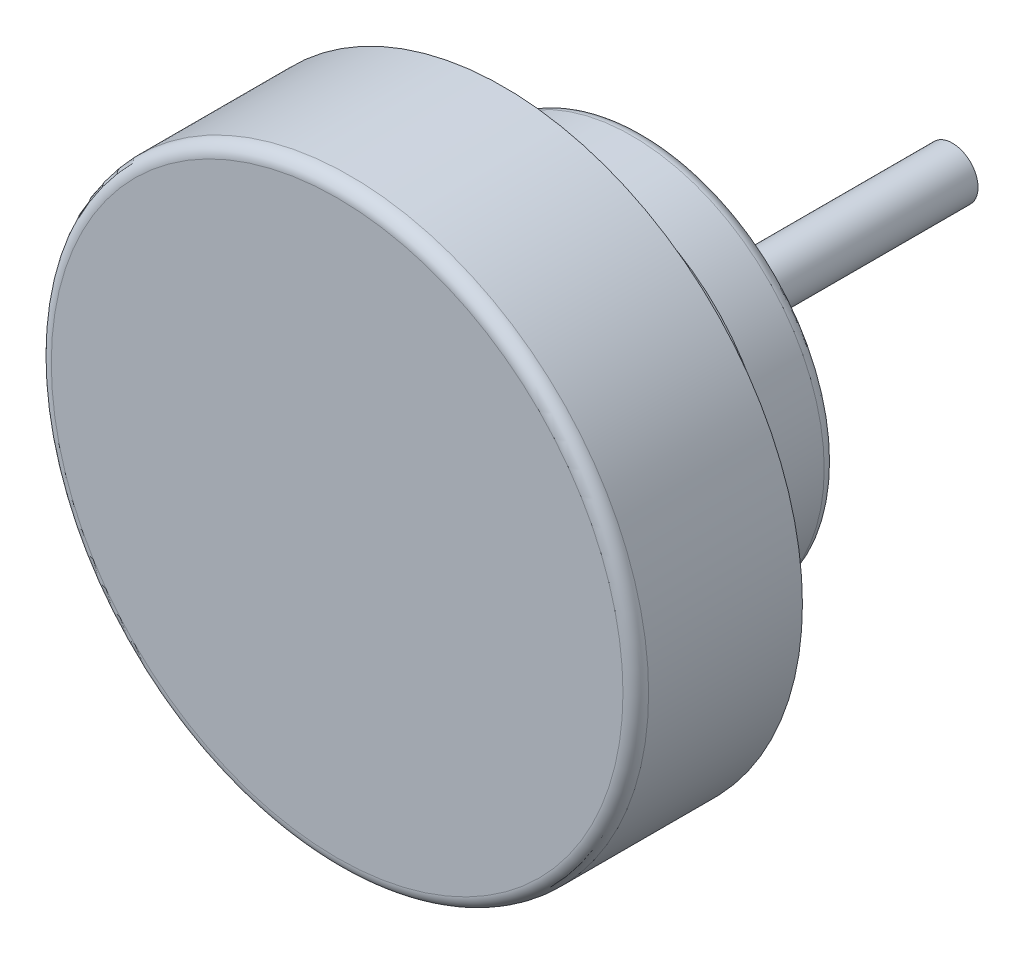
ISO-10303-21;
HEADER;
FILE_DESCRIPTION(('STEP AP214'),'2;1');
FILE_NAME('part.step','',(''),(''),'','','');
FILE_SCHEMA(('AUTOMOTIVE_DESIGN { 1 0 10303 214 1 1 1 1 }'));
ENDSEC;
DATA;
#1=APPLICATION_CONTEXT('core data for automotive mechanical design processes');
#2=APPLICATION_PROTOCOL_DEFINITION('international standard','automotive_design',2000,#1);
#3=PRODUCT_CONTEXT('',#1,'mechanical');
#4=PRODUCT('Part','Part','',(#3));
#5=PRODUCT_RELATED_PRODUCT_CATEGORY('part','',(#4));
#6=PRODUCT_DEFINITION_FORMATION('','',#4);
#7=PRODUCT_DEFINITION_CONTEXT('part definition',#1,'design');
#8=PRODUCT_DEFINITION('design','',#6,#7);
#9=PRODUCT_DEFINITION_SHAPE('','',#8);
#10=(LENGTH_UNIT() NAMED_UNIT(*) SI_UNIT(.MILLI.,.METRE.));
#11=(NAMED_UNIT(*) PLANE_ANGLE_UNIT() SI_UNIT($,.RADIAN.));
#12=(NAMED_UNIT(*) SI_UNIT($,.STERADIAN.) SOLID_ANGLE_UNIT());
#13=UNCERTAINTY_MEASURE_WITH_UNIT(LENGTH_MEASURE(1.E-05),#10,'distance_accuracy_value','');
#14=(GEOMETRIC_REPRESENTATION_CONTEXT(3) GLOBAL_UNCERTAINTY_ASSIGNED_CONTEXT((#13)) GLOBAL_UNIT_ASSIGNED_CONTEXT((#10,
#11,#12)) REPRESENTATION_CONTEXT('',''));
#15=CARTESIAN_POINT('',(0.,0.,0.));
#16=DIRECTION('',(0.,0.,1.));
#17=DIRECTION('',(1.,0.,0.));
#18=AXIS2_PLACEMENT_3D('',#15,#16,#17);
#19=CARTESIAN_POINT('',(0.,0.,6.5));
#20=DIRECTION('',(0.,0.,-1.));
#21=DIRECTION('',(-1.,0.,0.));
#22=AXIS2_PLACEMENT_3D('',#19,#20,#21);
#23=CYLINDRICAL_SURFACE('',#22,11.65);
#24=CARTESIAN_POINT('',(0.,0.,6.));
#25=DIRECTION('',(0.,0.,1.));
#26=DIRECTION('',(1.,0.,0.));
#27=AXIS2_PLACEMENT_3D('',#24,#25,#26);
#28=CIRCLE('',#27,11.65);
#29=CARTESIAN_POINT('',(-11.65,0.,6.));
#30=VERTEX_POINT('',#29);
#31=EDGE_CURVE('E58',#30,#30,#28,.F.);
#32=CARTESIAN_POINT('',(0.,0.,0.));
#33=DIRECTION('',(0.,0.,1.));
#34=DIRECTION('',(1.,0.,0.));
#35=AXIS2_PLACEMENT_3D('',#32,#33,#34);
#36=CIRCLE('',#35,11.65);
#37=CARTESIAN_POINT('',(-11.65,0.,0.));
#38=VERTEX_POINT('',#37);
#39=EDGE_CURVE('E69',#38,#38,#36,.T.);
#40=CARTESIAN_POINT('',(-11.65,0.,6.));
#41=CARTESIAN_POINT('',(-11.65,0.,5.9375));
#42=CARTESIAN_POINT('',(-11.65,0.,5.875));
#43=CARTESIAN_POINT('',(-11.65,0.,5.75));
#44=CARTESIAN_POINT('',(-11.65,0.,5.6875));
#45=CARTESIAN_POINT('',(-11.65,0.,5.5625));
#46=CARTESIAN_POINT('',(-11.65,0.,5.5));
#47=CARTESIAN_POINT('',(-11.65,0.,5.375));
#48=CARTESIAN_POINT('',(-11.65,0.,5.3125));
#49=CARTESIAN_POINT('',(-11.65,0.,5.1875));
#50=CARTESIAN_POINT('',(-11.65,0.,5.125));
#51=CARTESIAN_POINT('',(-11.65,0.,5.));
#52=CARTESIAN_POINT('',(-11.65,0.,4.9375));
#53=CARTESIAN_POINT('',(-11.65,0.,4.8125));
#54=CARTESIAN_POINT('',(-11.65,0.,4.75));
#55=CARTESIAN_POINT('',(-11.65,0.,4.625));
#56=CARTESIAN_POINT('',(-11.65,0.,4.5625));
#57=CARTESIAN_POINT('',(-11.65,0.,4.4375));
#58=CARTESIAN_POINT('',(-11.65,0.,4.375));
#59=CARTESIAN_POINT('',(-11.65,0.,4.25));
#60=CARTESIAN_POINT('',(-11.65,0.,4.1875));
#61=CARTESIAN_POINT('',(-11.65,0.,4.0625));
#62=CARTESIAN_POINT('',(-11.65,0.,4.));
#63=CARTESIAN_POINT('',(-11.65,0.,3.875));
#64=CARTESIAN_POINT('',(-11.65,0.,3.8125));
#65=CARTESIAN_POINT('',(-11.65,0.,3.6875));
#66=CARTESIAN_POINT('',(-11.65,0.,3.625));
#67=CARTESIAN_POINT('',(-11.65,0.,3.5));
#68=CARTESIAN_POINT('',(-11.65,0.,3.4375));
#69=CARTESIAN_POINT('',(-11.65,0.,3.3125));
#70=CARTESIAN_POINT('',(-11.65,0.,3.25));
#71=CARTESIAN_POINT('',(-11.65,0.,3.125));
#72=CARTESIAN_POINT('',(-11.65,0.,3.0625));
#73=CARTESIAN_POINT('',(-11.65,0.,2.9375));
#74=CARTESIAN_POINT('',(-11.65,0.,2.875));
#75=CARTESIAN_POINT('',(-11.65,0.,2.75));
#76=CARTESIAN_POINT('',(-11.65,0.,2.6875));
#77=CARTESIAN_POINT('',(-11.65,0.,2.5625));
#78=CARTESIAN_POINT('',(-11.65,0.,2.5));
#79=CARTESIAN_POINT('',(-11.65,0.,2.375));
#80=CARTESIAN_POINT('',(-11.65,0.,2.3125));
#81=CARTESIAN_POINT('',(-11.65,0.,2.1875));
#82=CARTESIAN_POINT('',(-11.65,0.,2.125));
#83=CARTESIAN_POINT('',(-11.65,0.,2.));
#84=CARTESIAN_POINT('',(-11.65,0.,1.9375));
#85=CARTESIAN_POINT('',(-11.65,0.,1.8125));
#86=CARTESIAN_POINT('',(-11.65,0.,1.75));
#87=CARTESIAN_POINT('',(-11.65,0.,1.625));
#88=CARTESIAN_POINT('',(-11.65,0.,1.5625));
#89=CARTESIAN_POINT('',(-11.65,0.,1.4375));
#90=CARTESIAN_POINT('',(-11.65,0.,1.375));
#91=CARTESIAN_POINT('',(-11.65,0.,1.25));
#92=CARTESIAN_POINT('',(-11.65,0.,1.1875));
#93=CARTESIAN_POINT('',(-11.65,0.,1.0625));
#94=CARTESIAN_POINT('',(-11.65,0.,1.));
#95=CARTESIAN_POINT('',(-11.65,0.,0.875));
#96=CARTESIAN_POINT('',(-11.65,0.,0.8125));
#97=CARTESIAN_POINT('',(-11.65,0.,0.6875));
#98=CARTESIAN_POINT('',(-11.65,0.,0.625));
#99=CARTESIAN_POINT('',(-11.65,0.,0.5));
#100=CARTESIAN_POINT('',(-11.65,0.,0.4375));
#101=CARTESIAN_POINT('',(-11.65,0.,0.3125));
#102=CARTESIAN_POINT('',(-11.65,0.,0.25));
#103=CARTESIAN_POINT('',(-11.65,0.,0.125));
#104=CARTESIAN_POINT('',(-11.65,0.,0.0625000000000001));
#105=CARTESIAN_POINT('',(-11.65,0.,0.));
#106=B_SPLINE_CURVE_WITH_KNOTS('',3,(#40,#41,#42,#43,#44,#45,#46,#47,#48,#49,#50,#51,#52,#53,
#54,#55,#56,#57,#58,#59,#60,#61,#62,#63,#64,#65,#66,#67,#68,#69,#70,#71,#72,#73,#74,#75,#76,#77,
#78,#79,#80,#81,#82,#83,#84,#85,#86,#87,#88,#89,#90,#91,#92,#93,#94,#95,#96,#97,#98,#99,#100,
#101,#102,#103,#104,#105),.UNSPECIFIED.,.F.,.F.,(4,2,2,2,2,2,2,2,2,2,2,2,2,2,2,2,2,2,2,2,2,2,2,
2,2,2,2,2,2,2,2,2,4),(0.,0.187499999999999,0.374999999999999,0.5625,0.75,0.9375,1.125,1.3125,
1.5,1.6875,1.875,2.0625,2.25,2.4375,2.625,2.8125,3.,3.1875,3.375,3.5625,3.75,3.9375,4.125,
4.3125,4.5,4.6875,4.875,5.0625,5.25,5.4375,5.625,5.8125,6.),.UNSPECIFIED.);
#107=EDGE_CURVE('BSEAM44',#30,#38,#106,.T.);
#108=ORIENTED_EDGE('',*,*,#31,.T.);
#109=ORIENTED_EDGE('',*,*,#39,.T.);
#110=ORIENTED_EDGE('',*,*,#107,.T.);
#111=ORIENTED_EDGE('',*,*,#107,.F.);
#112=EDGE_LOOP('',(#108,#110,#109,#111));
#113=FACE_BOUND('',#112,.T.);
#114=ADVANCED_FACE('F44',(#113),#23,.T.);
#115=CARTESIAN_POINT('',(0.,0.,6.5));
#116=DIRECTION('',(0.,0.,1.));
#117=DIRECTION('',(1.,0.,0.));
#118=AXIS2_PLACEMENT_3D('',#115,#116,#117);
#119=PLANE('',#118);
#120=CARTESIAN_POINT('',(0.,0.,6.5));
#121=DIRECTION('',(0.,0.,1.));
#122=DIRECTION('',(1.,0.,0.));
#123=AXIS2_PLACEMENT_3D('',#120,#121,#122);
#124=CIRCLE('',#123,11.15);
#125=CARTESIAN_POINT('',(11.15,0.,6.5));
#126=VERTEX_POINT('',#125);
#127=EDGE_CURVE('E64',#126,#126,#124,.T.);
#128=ORIENTED_EDGE('',*,*,#127,.T.);
#129=EDGE_LOOP('',(#128));
#130=FACE_BOUND('',#129,.T.);
#131=ADVANCED_FACE('F135',(#130),#119,.T.);
#132=CARTESIAN_POINT('',(0.,0.,0.));
#133=DIRECTION('',(0.,0.,1.));
#134=DIRECTION('',(1.,0.,0.));
#135=AXIS2_PLACEMENT_3D('',#132,#133,#134);
#136=PLANE('',#135);
#137=CARTESIAN_POINT('',(0.,0.,0.));
#138=DIRECTION('',(0.,0.,-1.));
#139=DIRECTION('',(-1.,0.,0.));
#140=AXIS2_PLACEMENT_3D('',#137,#138,#139);
#141=CIRCLE('',#140,3.25);
#142=CARTESIAN_POINT('',(-3.25,0.,0.));
#143=VERTEX_POINT('',#142);
#144=EDGE_CURVE('E57',#143,#143,#141,.T.);
#145=ORIENTED_EDGE('',*,*,#144,.F.);
#146=EDGE_LOOP('',(#145));
#147=FACE_BOUND('',#146,.T.);
#148=ORIENTED_EDGE('',*,*,#39,.F.);
#149=EDGE_LOOP('',(#148));
#150=FACE_BOUND('',#149,.T.);
#151=ADVANCED_FACE('F139',(#147,#150),#136,.F.);
#152=CARTESIAN_POINT('',(0.,0.,6.));
#153=DIRECTION('',(0.,0.,1.));
#154=DIRECTION('',(1.,0.,0.));
#155=AXIS2_PLACEMENT_3D('',#152,#153,#154);
#156=TOROIDAL_SURFACE('',#155,11.15,0.5);
#157=ORIENTED_EDGE('',*,*,#31,.F.);
#158=EDGE_LOOP('',(#157));
#159=FACE_BOUND('',#158,.T.);
#160=ORIENTED_EDGE('',*,*,#127,.F.);
#161=EDGE_LOOP('',(#160));
#162=FACE_BOUND('',#161,.T.);
#163=ADVANCED_FACE('F126',(#159,#162),#156,.T.);
#164=CARTESIAN_POINT('',(0.,0.,-3.));
#165=DIRECTION('',(0.,0.,1.));
#166=DIRECTION('',(1.,0.,0.));
#167=AXIS2_PLACEMENT_3D('',#164,#165,#166);
#168=CYLINDRICAL_SURFACE('',#167,3.25);
#169=CARTESIAN_POINT('',(0.,0.,-3.));
#170=DIRECTION('',(0.,0.,-1.));
#171=DIRECTION('',(-1.,0.,0.));
#172=AXIS2_PLACEMENT_3D('',#169,#170,#171);
#173=CIRCLE('',#172,3.25);
#174=CARTESIAN_POINT('',(-3.25,0.,-3.));
#175=VERTEX_POINT('',#174);
#176=EDGE_CURVE('E68',#175,#175,#173,.T.);
#177=ORIENTED_EDGE('',*,*,#176,.F.);
#178=EDGE_LOOP('',(#177));
#179=FACE_BOUND('',#178,.T.);
#180=ORIENTED_EDGE('',*,*,#144,.T.);
#181=EDGE_LOOP('',(#180));
#182=FACE_BOUND('',#181,.T.);
#183=ADVANCED_FACE('F118',(#179,#182),#168,.T.);
#184=CARTESIAN_POINT('',(0.,0.,-5.5));
#185=DIRECTION('',(0.,0.,1.));
#186=DIRECTION('',(1.,0.,0.));
#187=AXIS2_PLACEMENT_3D('',#184,#185,#186);
#188=CYLINDRICAL_SURFACE('',#187,7.5);
#189=CARTESIAN_POINT('',(0.,0.,-5.));
#190=DIRECTION('',(0.,0.,-1.));
#191=DIRECTION('',(-1.,0.,0.));
#192=AXIS2_PLACEMENT_3D('',#189,#190,#191);
#193=CIRCLE('',#192,7.5);
#194=CARTESIAN_POINT('',(-7.5,0.,-5.));
#195=VERTEX_POINT('',#194);
#196=EDGE_CURVE('E10',#195,#195,#193,.F.);
#197=ORIENTED_EDGE('',*,*,#196,.T.);
#198=EDGE_LOOP('',(#197));
#199=FACE_BOUND('',#198,.T.);
#200=CARTESIAN_POINT('',(0.,0.,-3.));
#201=DIRECTION('',(0.,0.,-1.));
#202=DIRECTION('',(-1.,0.,0.));
#203=AXIS2_PLACEMENT_3D('',#200,#201,#202);
#204=CIRCLE('',#203,7.5);
#205=CARTESIAN_POINT('',(-7.5,0.,-3.));
#206=VERTEX_POINT('',#205);
#207=EDGE_CURVE('E74',#206,#206,#204,.T.);
#208=ORIENTED_EDGE('',*,*,#207,.T.);
#209=EDGE_LOOP('',(#208));
#210=FACE_BOUND('',#209,.T.);
#211=ADVANCED_FACE('F120',(#199,#210),#188,.T.);
#212=CARTESIAN_POINT('',(0.,0.,-5.5));
#213=DIRECTION('',(0.,0.,-1.));
#214=DIRECTION('',(-1.,0.,0.));
#215=AXIS2_PLACEMENT_3D('',#212,#213,#214);
#216=PLANE('',#215);
#217=CARTESIAN_POINT('',(-4.54663336986833,-2.62499999999996,-5.5));
#218=DIRECTION('',(0.,0.,-1.));
#219=DIRECTION('',(-1.,0.,0.));
#220=AXIS2_PLACEMENT_3D('',#217,#218,#219);
#221=CIRCLE('',#220,1.);
#222=CARTESIAN_POINT('',(-5.54663336986833,-2.62499999999996,-5.5));
#223=VERTEX_POINT('',#222);
#224=EDGE_CURVE('E82',#223,#223,#221,.T.);
#225=ORIENTED_EDGE('',*,*,#224,.F.);
#226=EDGE_LOOP('',(#225));
#227=FACE_BOUND('',#226,.T.);
#228=CARTESIAN_POINT('',(0.,5.25,-5.5));
#229=DIRECTION('',(0.,0.,-1.));
#230=DIRECTION('',(-1.,0.,0.));
#231=AXIS2_PLACEMENT_3D('',#228,#229,#230);
#232=CIRCLE('',#231,1.);
#233=CARTESIAN_POINT('',(-1.,5.25,-5.5));
#234=VERTEX_POINT('',#233);
#235=EDGE_CURVE('E87',#234,#234,#232,.T.);
#236=ORIENTED_EDGE('',*,*,#235,.F.);
#237=EDGE_LOOP('',(#236));
#238=FACE_BOUND('',#237,.T.);
#239=CARTESIAN_POINT('',(4.54663336986829,-2.62500000000002,-5.5));
#240=DIRECTION('',(0.,0.,-1.));
#241=DIRECTION('',(-1.,0.,0.));
#242=AXIS2_PLACEMENT_3D('',#239,#240,#241);
#243=CIRCLE('',#242,1.);
#244=CARTESIAN_POINT('',(3.54663336986829,-2.62500000000002,-5.5));
#245=VERTEX_POINT('',#244);
#246=EDGE_CURVE('E86',#245,#245,#243,.T.);
#247=ORIENTED_EDGE('',*,*,#246,.F.);
#248=EDGE_LOOP('',(#247));
#249=FACE_BOUND('',#248,.T.);
#250=CARTESIAN_POINT('',(0.,0.,-5.5));
#251=DIRECTION('',(0.,0.,-1.));
#252=DIRECTION('',(-1.,0.,0.));
#253=AXIS2_PLACEMENT_3D('',#250,#251,#252);
#254=CIRCLE('',#253,1.);
#255=CARTESIAN_POINT('',(-1.,0.,-5.5));
#256=VERTEX_POINT('',#255);
#257=EDGE_CURVE('E77',#256,#256,#254,.T.);
#258=ORIENTED_EDGE('',*,*,#257,.F.);
#259=EDGE_LOOP('',(#258));
#260=FACE_BOUND('',#259,.T.);
#261=CARTESIAN_POINT('',(0.,0.,-5.5));
#262=DIRECTION('',(0.,0.,-1.));
#263=DIRECTION('',(-1.,0.,0.));
#264=AXIS2_PLACEMENT_3D('',#261,#262,#263);
#265=CIRCLE('',#264,7.);
#266=CARTESIAN_POINT('',(-7.,0.,-5.5));
#267=VERTEX_POINT('',#266);
#268=EDGE_CURVE('E55',#267,#267,#265,.T.);
#269=ORIENTED_EDGE('',*,*,#268,.T.);
#270=EDGE_LOOP('',(#269));
#271=FACE_BOUND('',#270,.T.);
#272=ADVANCED_FACE('F110',(#227,#238,#249,#260,#271),#216,.T.);
#273=CARTESIAN_POINT('',(0.,0.,-3.));
#274=DIRECTION('',(0.,0.,-1.));
#275=DIRECTION('',(-1.,0.,0.));
#276=AXIS2_PLACEMENT_3D('',#273,#274,#275);
#277=PLANE('',#276);
#278=CARTESIAN_POINT('',(-4.54663336986833,-2.62499999999996,-3.));
#279=DIRECTION('',(0.,0.,-1.));
#280=DIRECTION('',(-1.,0.,0.));
#281=AXIS2_PLACEMENT_3D('',#278,#279,#280);
#282=CIRCLE('',#281,1.);
#283=CARTESIAN_POINT('',(-5.54663336986833,-2.62499999999996,-3.));
#284=VERTEX_POINT('',#283);
#285=EDGE_CURVE('E94',#284,#284,#282,.F.);
#286=ORIENTED_EDGE('',*,*,#285,.F.);
#287=EDGE_LOOP('',(#286));
#288=FACE_BOUND('',#287,.T.);
#289=CARTESIAN_POINT('',(0.,5.25,-3.));
#290=DIRECTION('',(0.,0.,-1.));
#291=DIRECTION('',(-1.,0.,0.));
#292=AXIS2_PLACEMENT_3D('',#289,#290,#291);
#293=CIRCLE('',#292,1.);
#294=CARTESIAN_POINT('',(-1.,5.25,-3.));
#295=VERTEX_POINT('',#294);
#296=EDGE_CURVE('E93',#295,#295,#293,.F.);
#297=ORIENTED_EDGE('',*,*,#296,.F.);
#298=EDGE_LOOP('',(#297));
#299=FACE_BOUND('',#298,.T.);
#300=CARTESIAN_POINT('',(4.54663336986829,-2.62500000000002,-3.));
#301=DIRECTION('',(0.,0.,-1.));
#302=DIRECTION('',(-1.,0.,0.));
#303=AXIS2_PLACEMENT_3D('',#300,#301,#302);
#304=CIRCLE('',#303,1.);
#305=CARTESIAN_POINT('',(3.54663336986829,-2.62500000000002,-3.));
#306=VERTEX_POINT('',#305);
#307=EDGE_CURVE('E81',#306,#306,#304,.F.);
#308=ORIENTED_EDGE('',*,*,#307,.F.);
#309=EDGE_LOOP('',(#308));
#310=FACE_BOUND('',#309,.T.);
#311=ORIENTED_EDGE('',*,*,#176,.T.);
#312=EDGE_LOOP('',(#311));
#313=FACE_BOUND('',#312,.T.);
#314=ORIENTED_EDGE('',*,*,#207,.F.);
#315=EDGE_LOOP('',(#314));
#316=FACE_BOUND('',#315,.T.);
#317=ADVANCED_FACE('F102',(#288,#299,#310,#313,#316),#277,.F.);
#318=CARTESIAN_POINT('',(0.,0.,-5.));
#319=DIRECTION('',(0.,0.,-1.));
#320=DIRECTION('',(-1.,0.,0.));
#321=AXIS2_PLACEMENT_3D('',#318,#319,#320);
#322=TOROIDAL_SURFACE('',#321,7.,0.5);
#323=ORIENTED_EDGE('',*,*,#196,.F.);
#324=EDGE_LOOP('',(#323));
#325=FACE_BOUND('',#324,.T.);
#326=ORIENTED_EDGE('',*,*,#268,.F.);
#327=EDGE_LOOP('',(#326));
#328=FACE_BOUND('',#327,.T.);
#329=ADVANCED_FACE('F50',(#325,#328),#322,.T.);
#330=CARTESIAN_POINT('',(0.,0.,-17.5));
#331=DIRECTION('',(0.,0.,1.));
#332=DIRECTION('',(1.,0.,0.));
#333=AXIS2_PLACEMENT_3D('',#330,#331,#332);
#334=CYLINDRICAL_SURFACE('',#333,1.);
#335=CARTESIAN_POINT('',(0.,0.,-17.5));
#336=DIRECTION('',(0.,0.,-1.));
#337=DIRECTION('',(-1.,0.,0.));
#338=AXIS2_PLACEMENT_3D('',#335,#336,#337);
#339=CIRCLE('',#338,1.);
#340=CARTESIAN_POINT('',(-1.,0.,-17.5));
#341=VERTEX_POINT('',#340);
#342=EDGE_CURVE('E80',#341,#341,#339,.T.);
#343=ORIENTED_EDGE('',*,*,#342,.F.);
#344=EDGE_LOOP('',(#343));
#345=FACE_BOUND('',#344,.T.);
#346=ORIENTED_EDGE('',*,*,#257,.T.);
#347=EDGE_LOOP('',(#346));
#348=FACE_BOUND('',#347,.T.);
#349=ADVANCED_FACE('F191',(#345,#348),#334,.T.);
#350=CARTESIAN_POINT('',(0.,0.,-17.5));
#351=DIRECTION('',(0.,0.,-1.));
#352=DIRECTION('',(-1.,0.,0.));
#353=AXIS2_PLACEMENT_3D('',#350,#351,#352);
#354=PLANE('',#353);
#355=ORIENTED_EDGE('',*,*,#342,.T.);
#356=EDGE_LOOP('',(#355));
#357=FACE_BOUND('',#356,.T.);
#358=ADVANCED_FACE('F201',(#357),#354,.T.);
#359=CARTESIAN_POINT('',(4.54663336986829,-2.62500000000002,6.501));
#360=DIRECTION('',(0.,0.,-1.));
#361=DIRECTION('',(-1.,0.,0.));
#362=AXIS2_PLACEMENT_3D('',#359,#360,#361);
#363=CYLINDRICAL_SURFACE('',#362,1.);
#364=ORIENTED_EDGE('',*,*,#246,.T.);
#365=EDGE_LOOP('',(#364));
#366=FACE_BOUND('',#365,.T.);
#367=ORIENTED_EDGE('',*,*,#307,.T.);
#368=EDGE_LOOP('',(#367));
#369=FACE_BOUND('',#368,.T.);
#370=ADVANCED_FACE('F215',(#366,#369),#363,.F.);
#371=CARTESIAN_POINT('',(0.,5.25,6.501));
#372=DIRECTION('',(0.,0.,-1.));
#373=DIRECTION('',(-1.,0.,0.));
#374=AXIS2_PLACEMENT_3D('',#371,#372,#373);
#375=CYLINDRICAL_SURFACE('',#374,1.);
#376=ORIENTED_EDGE('',*,*,#235,.T.);
#377=EDGE_LOOP('',(#376));
#378=FACE_BOUND('',#377,.T.);
#379=ORIENTED_EDGE('',*,*,#296,.T.);
#380=EDGE_LOOP('',(#379));
#381=FACE_BOUND('',#380,.T.);
#382=ADVANCED_FACE('F222',(#378,#381),#375,.F.);
#383=CARTESIAN_POINT('',(-4.54663336986833,-2.62499999999996,6.501));
#384=DIRECTION('',(0.,0.,-1.));
#385=DIRECTION('',(-1.,0.,0.));
#386=AXIS2_PLACEMENT_3D('',#383,#384,#385);
#387=CYLINDRICAL_SURFACE('',#386,1.);
#388=ORIENTED_EDGE('',*,*,#224,.T.);
#389=EDGE_LOOP('',(#388));
#390=FACE_BOUND('',#389,.T.);
#391=ORIENTED_EDGE('',*,*,#285,.T.);
#392=EDGE_LOOP('',(#391));
#393=FACE_BOUND('',#392,.T.);
#394=ADVANCED_FACE('F105',(#390,#393),#387,.F.);
#395=CLOSED_SHELL('',(#114,#131,#151,#163,#183,#211,#272,#317,#329,#349,#358,#370,#382,#394));
#396=MANIFOLD_SOLID_BREP('B2',#395);
#397=ADVANCED_BREP_SHAPE_REPRESENTATION('',(#18,#396),#14);
#398=SHAPE_DEFINITION_REPRESENTATION(#9,#397);
ENDSEC;
END-ISO-10303-21;
